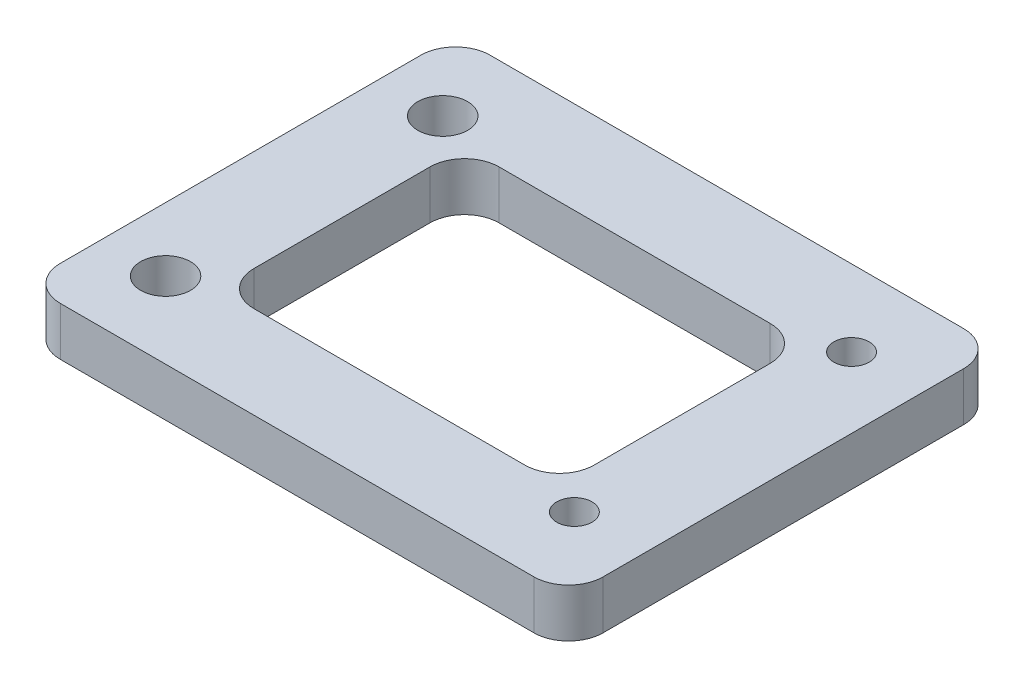
ISO-10303-21;
HEADER;
FILE_DESCRIPTION(('STEP AP214'),'2;1');
FILE_NAME('part.step','',(''),(''),'','','');
FILE_SCHEMA(('AUTOMOTIVE_DESIGN { 1 0 10303 214 1 1 1 1 }'));
ENDSEC;
DATA;
#1=APPLICATION_CONTEXT('core data for automotive mechanical design processes');
#2=APPLICATION_PROTOCOL_DEFINITION('international standard','automotive_design',2000,#1);
#3=PRODUCT_CONTEXT('',#1,'mechanical');
#4=PRODUCT('Part','Part','',(#3));
#5=PRODUCT_RELATED_PRODUCT_CATEGORY('part','',(#4));
#6=PRODUCT_DEFINITION_FORMATION('','',#4);
#7=PRODUCT_DEFINITION_CONTEXT('part definition',#1,'design');
#8=PRODUCT_DEFINITION('design','',#6,#7);
#9=PRODUCT_DEFINITION_SHAPE('','',#8);
#10=(LENGTH_UNIT() NAMED_UNIT(*) SI_UNIT(.MILLI.,.METRE.));
#11=(NAMED_UNIT(*) PLANE_ANGLE_UNIT() SI_UNIT($,.RADIAN.));
#12=(NAMED_UNIT(*) SI_UNIT($,.STERADIAN.) SOLID_ANGLE_UNIT());
#13=UNCERTAINTY_MEASURE_WITH_UNIT(LENGTH_MEASURE(1.E-05),#10,'distance_accuracy_value','');
#14=(GEOMETRIC_REPRESENTATION_CONTEXT(3) GLOBAL_UNCERTAINTY_ASSIGNED_CONTEXT((#13)) GLOBAL_UNIT_ASSIGNED_CONTEXT((#10,
#11,#12)) REPRESENTATION_CONTEXT('',''));
#15=CARTESIAN_POINT('',(0.,0.,0.));
#16=DIRECTION('',(0.,0.,1.));
#17=DIRECTION('',(1.,0.,0.));
#18=AXIS2_PLACEMENT_3D('',#15,#16,#17);
#19=CARTESIAN_POINT('',(0.,7.,0.));
#20=DIRECTION('',(0.,-1.,0.));
#21=DIRECTION('',(0.,0.,-1.));
#22=AXIS2_PLACEMENT_3D('',#19,#20,#21);
#23=PLANE('',#22);
#24=DIRECTION('',(0.,0.,1.));
#25=VECTOR('',#24,1.);
#26=CARTESIAN_POINT('',(-39.1771393497362,7.,31.0193391206574));
#27=LINE('',#26,#25);
#28=CARTESIAN_POINT('',(-39.1771393497362,7.,-26.0193391206574));
#29=VERTEX_POINT('',#28);
#30=CARTESIAN_POINT('',(-39.1771393497362,7.,26.0193391206574));
#31=VERTEX_POINT('',#30);
#32=EDGE_CURVE('E282',#29,#31,#27,.T.);
#33=ORIENTED_EDGE('',*,*,#32,.T.);
#34=CARTESIAN_POINT('',(-34.1771393497362,7.,26.0193391206574));
#35=DIRECTION('',(0.,-1.,0.));
#36=DIRECTION('',(0.,0.,-1.));
#37=AXIS2_PLACEMENT_3D('',#34,#35,#36);
#38=CIRCLE('',#37,5.);
#39=CARTESIAN_POINT('',(-34.1771393497362,7.,31.0193391206574));
#40=VERTEX_POINT('',#39);
#41=EDGE_CURVE('E201',#31,#40,#38,.F.);
#42=ORIENTED_EDGE('',*,*,#41,.T.);
#43=DIRECTION('',(1.,0.,0.));
#44=VECTOR('',#43,1.);
#45=CARTESIAN_POINT('',(-39.1771393497362,7.,31.0193391206574));
#46=LINE('',#45,#44);
#47=CARTESIAN_POINT('',(34.1771393497362,7.,31.0193391206574));
#48=VERTEX_POINT('',#47);
#49=EDGE_CURVE('E170',#40,#48,#46,.T.);
#50=ORIENTED_EDGE('',*,*,#49,.T.);
#51=CARTESIAN_POINT('',(34.1771393497362,7.,26.0193391206574));
#52=DIRECTION('',(0.,-1.,0.));
#53=DIRECTION('',(0.,0.,-1.));
#54=AXIS2_PLACEMENT_3D('',#51,#52,#53);
#55=CIRCLE('',#54,5.);
#56=CARTESIAN_POINT('',(39.1771393497362,7.,26.0193391206574));
#57=VERTEX_POINT('',#56);
#58=EDGE_CURVE('E199',#48,#57,#55,.F.);
#59=ORIENTED_EDGE('',*,*,#58,.T.);
#60=DIRECTION('',(0.,0.,-1.));
#61=VECTOR('',#60,1.);
#62=CARTESIAN_POINT('',(39.1771393497362,7.,31.0193391206574));
#63=LINE('',#62,#61);
#64=CARTESIAN_POINT('',(39.1771393497362,7.,-26.0193391206574));
#65=VERTEX_POINT('',#64);
#66=EDGE_CURVE('E177',#57,#65,#63,.T.);
#67=ORIENTED_EDGE('',*,*,#66,.T.);
#68=CARTESIAN_POINT('',(34.1771393497362,7.,-26.0193391206574));
#69=DIRECTION('',(0.,-1.,0.));
#70=DIRECTION('',(0.,0.,-1.));
#71=AXIS2_PLACEMENT_3D('',#68,#69,#70);
#72=CIRCLE('',#71,5.);
#73=CARTESIAN_POINT('',(34.1771393497362,7.,-31.0193391206574));
#74=VERTEX_POINT('',#73);
#75=EDGE_CURVE('E197',#65,#74,#72,.F.);
#76=ORIENTED_EDGE('',*,*,#75,.T.);
#77=DIRECTION('',(-1.,0.,0.));
#78=VECTOR('',#77,1.);
#79=CARTESIAN_POINT('',(-39.1771393497362,7.,-31.0193391206574));
#80=LINE('',#79,#78);
#81=CARTESIAN_POINT('',(-34.1771393497362,7.,-31.0193391206574));
#82=VERTEX_POINT('',#81);
#83=EDGE_CURVE('E181',#74,#82,#80,.T.);
#84=ORIENTED_EDGE('',*,*,#83,.T.);
#85=CARTESIAN_POINT('',(-34.1771393497362,7.,-26.0193391206574));
#86=DIRECTION('',(0.,-1.,0.));
#87=DIRECTION('',(0.,0.,-1.));
#88=AXIS2_PLACEMENT_3D('',#85,#86,#87);
#89=CIRCLE('',#88,5.);
#90=EDGE_CURVE('E195',#82,#29,#89,.F.);
#91=ORIENTED_EDGE('',*,*,#90,.T.);
#92=EDGE_LOOP('',(#33,#42,#50,#59,#67,#76,#84,#91));
#93=FACE_BOUND('',#92,.T.);
#94=DIRECTION('',(0.,0.,-1.));
#95=VECTOR('',#94,1.);
#96=CARTESIAN_POINT('',(24.5578802097972,7.,17.7048808811984));
#97=LINE('',#96,#95);
#98=CARTESIAN_POINT('',(24.5578802097972,7.,12.7048808811984));
#99=VERTEX_POINT('',#98);
#100=CARTESIAN_POINT('',(24.5578802097972,7.,-12.7048808811984));
#101=VERTEX_POINT('',#100);
#102=EDGE_CURVE('E262',#99,#101,#97,.T.);
#103=ORIENTED_EDGE('',*,*,#102,.F.);
#104=CARTESIAN_POINT('',(19.5578802097972,7.,12.7048808811984));
#105=DIRECTION('',(0.,-1.,0.));
#106=DIRECTION('',(0.,0.,-1.));
#107=AXIS2_PLACEMENT_3D('',#104,#105,#106);
#108=CIRCLE('',#107,5.);
#109=CARTESIAN_POINT('',(19.5578802097972,7.,17.7048808811984));
#110=VERTEX_POINT('',#109);
#111=EDGE_CURVE('E238',#99,#110,#108,.T.);
#112=ORIENTED_EDGE('',*,*,#111,.T.);
#113=DIRECTION('',(1.,0.,0.));
#114=VECTOR('',#113,1.);
#115=CARTESIAN_POINT('',(-24.5578802097972,7.,17.7048808811984));
#116=LINE('',#115,#114);
#117=CARTESIAN_POINT('',(-19.5578802097972,7.,17.7048808811984));
#118=VERTEX_POINT('',#117);
#119=EDGE_CURVE('E264',#118,#110,#116,.T.);
#120=ORIENTED_EDGE('',*,*,#119,.F.);
#121=CARTESIAN_POINT('',(-19.5578802097972,7.,12.7048808811984));
#122=DIRECTION('',(0.,-1.,0.));
#123=DIRECTION('',(0.,0.,-1.));
#124=AXIS2_PLACEMENT_3D('',#121,#122,#123);
#125=CIRCLE('',#124,5.);
#126=CARTESIAN_POINT('',(-24.5578802097972,7.,12.7048808811984));
#127=VERTEX_POINT('',#126);
#128=EDGE_CURVE('E234',#118,#127,#125,.T.);
#129=ORIENTED_EDGE('',*,*,#128,.T.);
#130=DIRECTION('',(0.,0.,1.));
#131=VECTOR('',#130,1.);
#132=CARTESIAN_POINT('',(-24.5578802097972,7.,17.7048808811984));
#133=LINE('',#132,#131);
#134=CARTESIAN_POINT('',(-24.5578802097972,7.,-12.7048808811984));
#135=VERTEX_POINT('',#134);
#136=EDGE_CURVE('E261',#135,#127,#133,.T.);
#137=ORIENTED_EDGE('',*,*,#136,.F.);
#138=CARTESIAN_POINT('',(-19.5578802097972,7.,-12.7048808811984));
#139=DIRECTION('',(0.,-1.,0.));
#140=DIRECTION('',(0.,0.,-1.));
#141=AXIS2_PLACEMENT_3D('',#138,#139,#140);
#142=CIRCLE('',#141,5.);
#143=CARTESIAN_POINT('',(-19.5578802097972,7.,-17.7048808811984));
#144=VERTEX_POINT('',#143);
#145=EDGE_CURVE('E11',#135,#144,#142,.T.);
#146=ORIENTED_EDGE('',*,*,#145,.T.);
#147=DIRECTION('',(-1.,0.,0.));
#148=VECTOR('',#147,1.);
#149=CARTESIAN_POINT('',(-24.5578802097972,7.,-17.7048808811984));
#150=LINE('',#149,#148);
#151=CARTESIAN_POINT('',(19.5578802097972,7.,-17.7048808811984));
#152=VERTEX_POINT('',#151);
#153=EDGE_CURVE('E259',#152,#144,#150,.T.);
#154=ORIENTED_EDGE('',*,*,#153,.F.);
#155=CARTESIAN_POINT('',(19.5578802097972,7.,-12.7048808811984));
#156=DIRECTION('',(0.,-1.,0.));
#157=DIRECTION('',(0.,0.,-1.));
#158=AXIS2_PLACEMENT_3D('',#155,#156,#157);
#159=CIRCLE('',#158,5.);
#160=EDGE_CURVE('E242',#152,#101,#159,.T.);
#161=ORIENTED_EDGE('',*,*,#160,.T.);
#162=EDGE_LOOP('',(#103,#112,#120,#129,#137,#146,#154,#161));
#163=FACE_BOUND('',#162,.T.);
#164=CARTESIAN_POINT('',(29.,7.,-20.));
#165=DIRECTION('',(0.,1.,0.));
#166=DIRECTION('',(0.,0.,1.));
#167=AXIS2_PLACEMENT_3D('',#164,#165,#166);
#168=CIRCLE('',#167,2.55);
#169=CARTESIAN_POINT('',(29.,7.,-17.45));
#170=VERTEX_POINT('',#169);
#171=EDGE_CURVE('E276',#170,#170,#168,.T.);
#172=ORIENTED_EDGE('',*,*,#171,.F.);
#173=EDGE_LOOP('',(#172));
#174=FACE_BOUND('',#173,.T.);
#175=CARTESIAN_POINT('',(29.,7.,20.));
#176=DIRECTION('',(0.,1.,0.));
#177=DIRECTION('',(0.,0.,1.));
#178=AXIS2_PLACEMENT_3D('',#175,#176,#177);
#179=CIRCLE('',#178,2.55);
#180=CARTESIAN_POINT('',(29.,7.,22.55));
#181=VERTEX_POINT('',#180);
#182=EDGE_CURVE('E369',#181,#181,#179,.T.);
#183=ORIENTED_EDGE('',*,*,#182,.F.);
#184=EDGE_LOOP('',(#183));
#185=FACE_BOUND('',#184,.T.);
#186=CARTESIAN_POINT('',(-30.,7.,20.));
#187=DIRECTION('',(0.,1.,0.));
#188=DIRECTION('',(0.,0.,1.));
#189=AXIS2_PLACEMENT_3D('',#186,#187,#188);
#190=CIRCLE('',#189,3.6);
#191=CARTESIAN_POINT('',(-30.,7.,23.6));
#192=VERTEX_POINT('',#191);
#193=EDGE_CURVE('E363',#192,#192,#190,.T.);
#194=ORIENTED_EDGE('',*,*,#193,.F.);
#195=EDGE_LOOP('',(#194));
#196=FACE_BOUND('',#195,.T.);
#197=CARTESIAN_POINT('',(-30.,7.,-20.));
#198=DIRECTION('',(0.,1.,0.));
#199=DIRECTION('',(0.,0.,1.));
#200=AXIS2_PLACEMENT_3D('',#197,#198,#199);
#201=CIRCLE('',#200,3.6);
#202=CARTESIAN_POINT('',(-30.,7.,-16.4));
#203=VERTEX_POINT('',#202);
#204=EDGE_CURVE('E354',#203,#203,#201,.T.);
#205=ORIENTED_EDGE('',*,*,#204,.F.);
#206=EDGE_LOOP('',(#205));
#207=FACE_BOUND('',#206,.T.);
#208=ADVANCED_FACE('F37',(#93,#163,#174,#185,#196,#207),#23,.F.);
#209=CARTESIAN_POINT('',(0.,0.,0.));
#210=DIRECTION('',(0.,-1.,0.));
#211=DIRECTION('',(0.,0.,-1.));
#212=AXIS2_PLACEMENT_3D('',#209,#210,#211);
#213=PLANE('',#212);
#214=CARTESIAN_POINT('',(-30.,0.,20.));
#215=DIRECTION('',(0.,1.,0.));
#216=DIRECTION('',(0.,0.,1.));
#217=AXIS2_PLACEMENT_3D('',#214,#215,#216);
#218=CIRCLE('',#217,3.6);
#219=CARTESIAN_POINT('',(-30.,0.,23.6));
#220=VERTEX_POINT('',#219);
#221=EDGE_CURVE('E360',#220,#220,#218,.T.);
#222=ORIENTED_EDGE('',*,*,#221,.T.);
#223=EDGE_LOOP('',(#222));
#224=FACE_BOUND('',#223,.T.);
#225=CARTESIAN_POINT('',(29.,0.,-20.));
#226=DIRECTION('',(0.,1.,0.));
#227=DIRECTION('',(0.,0.,1.));
#228=AXIS2_PLACEMENT_3D('',#225,#226,#227);
#229=CIRCLE('',#228,2.55);
#230=CARTESIAN_POINT('',(29.,0.,-17.45));
#231=VERTEX_POINT('',#230);
#232=EDGE_CURVE('E372',#231,#231,#229,.T.);
#233=ORIENTED_EDGE('',*,*,#232,.T.);
#234=EDGE_LOOP('',(#233));
#235=FACE_BOUND('',#234,.T.);
#236=DIRECTION('',(1.,0.,0.));
#237=VECTOR('',#236,1.);
#238=CARTESIAN_POINT('',(-39.1771393497362,0.,31.0193391206574));
#239=LINE('',#238,#237);
#240=CARTESIAN_POINT('',(-34.1771393497362,0.,31.0193391206574));
#241=VERTEX_POINT('',#240);
#242=CARTESIAN_POINT('',(34.1771393497362,0.,31.0193391206574));
#243=VERTEX_POINT('',#242);
#244=EDGE_CURVE('E167',#241,#243,#239,.T.);
#245=ORIENTED_EDGE('',*,*,#244,.F.);
#246=CARTESIAN_POINT('',(-34.1771393497362,0.,26.0193391206574));
#247=DIRECTION('',(0.,-1.,0.));
#248=DIRECTION('',(0.,0.,-1.));
#249=AXIS2_PLACEMENT_3D('',#246,#247,#248);
#250=CIRCLE('',#249,5.);
#251=CARTESIAN_POINT('',(-39.1771393497362,0.,26.0193391206574));
#252=VERTEX_POINT('',#251);
#253=EDGE_CURVE('E150',#241,#252,#250,.T.);
#254=ORIENTED_EDGE('',*,*,#253,.T.);
#255=DIRECTION('',(0.,0.,1.));
#256=VECTOR('',#255,1.);
#257=CARTESIAN_POINT('',(-39.1771393497362,0.,31.0193391206574));
#258=LINE('',#257,#256);
#259=CARTESIAN_POINT('',(-39.1771393497362,0.,-26.0193391206574));
#260=VERTEX_POINT('',#259);
#261=EDGE_CURVE('E178',#260,#252,#258,.T.);
#262=ORIENTED_EDGE('',*,*,#261,.F.);
#263=CARTESIAN_POINT('',(-34.1771393497362,0.,-26.0193391206574));
#264=DIRECTION('',(0.,-1.,0.));
#265=DIRECTION('',(0.,0.,-1.));
#266=AXIS2_PLACEMENT_3D('',#263,#264,#265);
#267=CIRCLE('',#266,5.);
#268=CARTESIAN_POINT('',(-34.1771393497362,0.,-31.0193391206574));
#269=VERTEX_POINT('',#268);
#270=EDGE_CURVE('E171',#260,#269,#267,.T.);
#271=ORIENTED_EDGE('',*,*,#270,.T.);
#272=DIRECTION('',(-1.,0.,0.));
#273=VECTOR('',#272,1.);
#274=CARTESIAN_POINT('',(-39.1771393497362,0.,-31.0193391206574));
#275=LINE('',#274,#273);
#276=CARTESIAN_POINT('',(34.1771393497362,0.,-31.0193391206574));
#277=VERTEX_POINT('',#276);
#278=EDGE_CURVE('E183',#277,#269,#275,.T.);
#279=ORIENTED_EDGE('',*,*,#278,.F.);
#280=CARTESIAN_POINT('',(34.1771393497362,0.,-26.0193391206574));
#281=DIRECTION('',(0.,-1.,0.));
#282=DIRECTION('',(0.,0.,-1.));
#283=AXIS2_PLACEMENT_3D('',#280,#281,#282);
#284=CIRCLE('',#283,5.);
#285=CARTESIAN_POINT('',(39.1771393497362,0.,-26.0193391206574));
#286=VERTEX_POINT('',#285);
#287=EDGE_CURVE('E189',#277,#286,#284,.T.);
#288=ORIENTED_EDGE('',*,*,#287,.T.);
#289=DIRECTION('',(0.,0.,-1.));
#290=VECTOR('',#289,1.);
#291=CARTESIAN_POINT('',(39.1771393497362,0.,31.0193391206574));
#292=LINE('',#291,#290);
#293=CARTESIAN_POINT('',(39.1771393497362,0.,26.0193391206574));
#294=VERTEX_POINT('',#293);
#295=EDGE_CURVE('E272',#294,#286,#292,.T.);
#296=ORIENTED_EDGE('',*,*,#295,.F.);
#297=CARTESIAN_POINT('',(34.1771393497362,0.,26.0193391206574));
#298=DIRECTION('',(0.,-1.,0.));
#299=DIRECTION('',(0.,0.,-1.));
#300=AXIS2_PLACEMENT_3D('',#297,#298,#299);
#301=CIRCLE('',#300,5.);
#302=EDGE_CURVE('E161',#294,#243,#301,.T.);
#303=ORIENTED_EDGE('',*,*,#302,.T.);
#304=EDGE_LOOP('',(#245,#254,#262,#271,#279,#288,#296,#303));
#305=FACE_BOUND('',#304,.T.);
#306=DIRECTION('',(0.,0.,1.));
#307=VECTOR('',#306,1.);
#308=CARTESIAN_POINT('',(-24.5578802097972,0.,17.7048808811984));
#309=LINE('',#308,#307);
#310=CARTESIAN_POINT('',(-24.5578802097972,0.,-12.7048808811984));
#311=VERTEX_POINT('',#310);
#312=CARTESIAN_POINT('',(-24.5578802097972,0.,12.7048808811984));
#313=VERTEX_POINT('',#312);
#314=EDGE_CURVE('E247',#311,#313,#309,.T.);
#315=ORIENTED_EDGE('',*,*,#314,.T.);
#316=CARTESIAN_POINT('',(-19.5578802097972,0.,12.7048808811984));
#317=DIRECTION('',(0.,-1.,0.));
#318=DIRECTION('',(0.,0.,-1.));
#319=AXIS2_PLACEMENT_3D('',#316,#317,#318);
#320=CIRCLE('',#319,5.);
#321=CARTESIAN_POINT('',(-19.5578802097972,0.,17.7048808811984));
#322=VERTEX_POINT('',#321);
#323=EDGE_CURVE('E232',#313,#322,#320,.F.);
#324=ORIENTED_EDGE('',*,*,#323,.T.);
#325=DIRECTION('',(1.,0.,0.));
#326=VECTOR('',#325,1.);
#327=CARTESIAN_POINT('',(-24.5578802097972,0.,17.7048808811984));
#328=LINE('',#327,#326);
#329=CARTESIAN_POINT('',(19.5578802097972,0.,17.7048808811984));
#330=VERTEX_POINT('',#329);
#331=EDGE_CURVE('E256',#322,#330,#328,.T.);
#332=ORIENTED_EDGE('',*,*,#331,.T.);
#333=CARTESIAN_POINT('',(19.5578802097972,0.,12.7048808811984));
#334=DIRECTION('',(0.,-1.,0.));
#335=DIRECTION('',(0.,0.,-1.));
#336=AXIS2_PLACEMENT_3D('',#333,#334,#335);
#337=CIRCLE('',#336,5.);
#338=CARTESIAN_POINT('',(24.5578802097972,0.,12.7048808811984));
#339=VERTEX_POINT('',#338);
#340=EDGE_CURVE('E236',#330,#339,#337,.F.);
#341=ORIENTED_EDGE('',*,*,#340,.T.);
#342=DIRECTION('',(0.,0.,-1.));
#343=VECTOR('',#342,1.);
#344=CARTESIAN_POINT('',(24.5578802097972,0.,17.7048808811984));
#345=LINE('',#344,#343);
#346=CARTESIAN_POINT('',(24.5578802097972,0.,-12.7048808811984));
#347=VERTEX_POINT('',#346);
#348=EDGE_CURVE('E273',#339,#347,#345,.T.);
#349=ORIENTED_EDGE('',*,*,#348,.T.);
#350=CARTESIAN_POINT('',(19.5578802097972,0.,-12.7048808811984));
#351=DIRECTION('',(0.,-1.,0.));
#352=DIRECTION('',(0.,0.,-1.));
#353=AXIS2_PLACEMENT_3D('',#350,#351,#352);
#354=CIRCLE('',#353,5.);
#355=CARTESIAN_POINT('',(19.5578802097972,0.,-17.7048808811984));
#356=VERTEX_POINT('',#355);
#357=EDGE_CURVE('E240',#347,#356,#354,.F.);
#358=ORIENTED_EDGE('',*,*,#357,.T.);
#359=DIRECTION('',(-1.,0.,0.));
#360=VECTOR('',#359,1.);
#361=CARTESIAN_POINT('',(-24.5578802097972,0.,-17.7048808811984));
#362=LINE('',#361,#360);
#363=CARTESIAN_POINT('',(-19.5578802097972,0.,-17.7048808811984));
#364=VERTEX_POINT('',#363);
#365=EDGE_CURVE('E248',#356,#364,#362,.T.);
#366=ORIENTED_EDGE('',*,*,#365,.T.);
#367=CARTESIAN_POINT('',(-19.5578802097972,0.,-12.7048808811984));
#368=DIRECTION('',(0.,-1.,0.));
#369=DIRECTION('',(0.,0.,-1.));
#370=AXIS2_PLACEMENT_3D('',#367,#368,#369);
#371=CIRCLE('',#370,5.);
#372=EDGE_CURVE('E45',#364,#311,#371,.F.);
#373=ORIENTED_EDGE('',*,*,#372,.T.);
#374=EDGE_LOOP('',(#315,#324,#332,#341,#349,#358,#366,#373));
#375=FACE_BOUND('',#374,.T.);
#376=CARTESIAN_POINT('',(29.,0.,20.));
#377=DIRECTION('',(0.,1.,0.));
#378=DIRECTION('',(0.,0.,1.));
#379=AXIS2_PLACEMENT_3D('',#376,#377,#378);
#380=CIRCLE('',#379,2.55);
#381=CARTESIAN_POINT('',(29.,0.,22.55));
#382=VERTEX_POINT('',#381);
#383=EDGE_CURVE('E366',#382,#382,#380,.T.);
#384=ORIENTED_EDGE('',*,*,#383,.T.);
#385=EDGE_LOOP('',(#384));
#386=FACE_BOUND('',#385,.T.);
#387=CARTESIAN_POINT('',(-30.,0.,-20.));
#388=DIRECTION('',(0.,1.,0.));
#389=DIRECTION('',(0.,0.,1.));
#390=AXIS2_PLACEMENT_3D('',#387,#388,#389);
#391=CIRCLE('',#390,3.6);
#392=CARTESIAN_POINT('',(-30.,0.,-16.4));
#393=VERTEX_POINT('',#392);
#394=EDGE_CURVE('E357',#393,#393,#391,.T.);
#395=ORIENTED_EDGE('',*,*,#394,.T.);
#396=EDGE_LOOP('',(#395));
#397=FACE_BOUND('',#396,.T.);
#398=ADVANCED_FACE('F174',(#224,#235,#305,#375,#386,#397),#213,.T.);
#399=CARTESIAN_POINT('',(39.1771393497362,7.,31.0193391206574));
#400=DIRECTION('',(-1.,0.,0.));
#401=DIRECTION('',(0.,0.,1.));
#402=AXIS2_PLACEMENT_3D('',#399,#400,#401);
#403=PLANE('',#402);
#404=ORIENTED_EDGE('',*,*,#66,.F.);
#405=DIRECTION('',(0.,-1.,0.));
#406=VECTOR('',#405,1.);
#407=CARTESIAN_POINT('',(39.1771393497362,7.,26.0193391206574));
#408=LINE('',#407,#406);
#409=EDGE_CURVE('E215',#57,#294,#408,.T.);
#410=ORIENTED_EDGE('',*,*,#409,.T.);
#411=ORIENTED_EDGE('',*,*,#295,.T.);
#412=DIRECTION('',(0.,-1.,0.));
#413=VECTOR('',#412,1.);
#414=CARTESIAN_POINT('',(39.1771393497362,7.,-26.0193391206574));
#415=LINE('',#414,#413);
#416=EDGE_CURVE('E213',#286,#65,#415,.F.);
#417=ORIENTED_EDGE('',*,*,#416,.T.);
#418=EDGE_LOOP('',(#404,#410,#411,#417));
#419=FACE_BOUND('',#418,.T.);
#420=ADVANCED_FACE('F310',(#419),#403,.F.);
#421=CARTESIAN_POINT('',(-39.1771393497362,7.,-31.0193391206574));
#422=DIRECTION('',(0.,0.,1.));
#423=DIRECTION('',(1.,0.,0.));
#424=AXIS2_PLACEMENT_3D('',#421,#422,#423);
#425=PLANE('',#424);
#426=ORIENTED_EDGE('',*,*,#83,.F.);
#427=DIRECTION('',(0.,-1.,0.));
#428=VECTOR('',#427,1.);
#429=CARTESIAN_POINT('',(34.1771393497362,7.,-31.0193391206574));
#430=LINE('',#429,#428);
#431=EDGE_CURVE('E229',#74,#277,#430,.T.);
#432=ORIENTED_EDGE('',*,*,#431,.T.);
#433=ORIENTED_EDGE('',*,*,#278,.T.);
#434=DIRECTION('',(0.,-1.,0.));
#435=VECTOR('',#434,1.);
#436=CARTESIAN_POINT('',(-34.1771393497362,7.,-31.0193391206574));
#437=LINE('',#436,#435);
#438=EDGE_CURVE('E227',#269,#82,#437,.F.);
#439=ORIENTED_EDGE('',*,*,#438,.T.);
#440=EDGE_LOOP('',(#426,#432,#433,#439));
#441=FACE_BOUND('',#440,.T.);
#442=ADVANCED_FACE('F292',(#441),#425,.F.);
#443=CARTESIAN_POINT('',(-39.1771393497362,7.,31.0193391206574));
#444=DIRECTION('',(1.,0.,0.));
#445=DIRECTION('',(0.,0.,-1.));
#446=AXIS2_PLACEMENT_3D('',#443,#444,#445);
#447=PLANE('',#446);
#448=ORIENTED_EDGE('',*,*,#261,.T.);
#449=DIRECTION('',(0.,-1.,0.));
#450=VECTOR('',#449,1.);
#451=CARTESIAN_POINT('',(-39.1771393497362,7.,26.0193391206574));
#452=LINE('',#451,#450);
#453=EDGE_CURVE('E155',#252,#31,#452,.F.);
#454=ORIENTED_EDGE('',*,*,#453,.T.);
#455=ORIENTED_EDGE('',*,*,#32,.F.);
#456=DIRECTION('',(0.,-1.,0.));
#457=VECTOR('',#456,1.);
#458=CARTESIAN_POINT('',(-39.1771393497362,7.,-26.0193391206574));
#459=LINE('',#458,#457);
#460=EDGE_CURVE('E160',#29,#260,#459,.T.);
#461=ORIENTED_EDGE('',*,*,#460,.T.);
#462=EDGE_LOOP('',(#448,#454,#455,#461));
#463=FACE_BOUND('',#462,.T.);
#464=ADVANCED_FACE('F301',(#463),#447,.F.);
#465=CARTESIAN_POINT('',(-39.1771393497362,7.,31.0193391206574));
#466=DIRECTION('',(0.,0.,-1.));
#467=DIRECTION('',(-1.,0.,0.));
#468=AXIS2_PLACEMENT_3D('',#465,#466,#467);
#469=PLANE('',#468);
#470=ORIENTED_EDGE('',*,*,#49,.F.);
#471=DIRECTION('',(0.,-1.,0.));
#472=VECTOR('',#471,1.);
#473=CARTESIAN_POINT('',(-34.1771393497362,7.,31.0193391206574));
#474=LINE('',#473,#472);
#475=EDGE_CURVE('E154',#40,#241,#474,.T.);
#476=ORIENTED_EDGE('',*,*,#475,.T.);
#477=ORIENTED_EDGE('',*,*,#244,.T.);
#478=DIRECTION('',(0.,-1.,0.));
#479=VECTOR('',#478,1.);
#480=CARTESIAN_POINT('',(34.1771393497362,7.,31.0193391206574));
#481=LINE('',#480,#479);
#482=EDGE_CURVE('E172',#243,#48,#481,.F.);
#483=ORIENTED_EDGE('',*,*,#482,.T.);
#484=EDGE_LOOP('',(#470,#476,#477,#483));
#485=FACE_BOUND('',#484,.T.);
#486=ADVANCED_FACE('F166',(#485),#469,.F.);
#487=CARTESIAN_POINT('',(24.5578802097972,7.,17.7048808811984));
#488=DIRECTION('',(-1.,0.,0.));
#489=DIRECTION('',(0.,0.,1.));
#490=AXIS2_PLACEMENT_3D('',#487,#488,#489);
#491=PLANE('',#490);
#492=ORIENTED_EDGE('',*,*,#348,.F.);
#493=DIRECTION('',(0.,-1.,0.));
#494=VECTOR('',#493,1.);
#495=CARTESIAN_POINT('',(24.5578802097972,7.,12.7048808811984));
#496=LINE('',#495,#494);
#497=EDGE_CURVE('E221',#339,#99,#496,.F.);
#498=ORIENTED_EDGE('',*,*,#497,.T.);
#499=ORIENTED_EDGE('',*,*,#102,.T.);
#500=DIRECTION('',(0.,-1.,0.));
#501=VECTOR('',#500,1.);
#502=CARTESIAN_POINT('',(24.5578802097972,0.,-12.7048808811984));
#503=LINE('',#502,#501);
#504=EDGE_CURVE('E218',#101,#347,#503,.T.);
#505=ORIENTED_EDGE('',*,*,#504,.T.);
#506=EDGE_LOOP('',(#492,#498,#499,#505));
#507=FACE_BOUND('',#506,.T.);
#508=ADVANCED_FACE('F308',(#507),#491,.T.);
#509=CARTESIAN_POINT('',(-24.5578802097972,7.,-17.7048808811984));
#510=DIRECTION('',(0.,0.,1.));
#511=DIRECTION('',(1.,0.,0.));
#512=AXIS2_PLACEMENT_3D('',#509,#510,#511);
#513=PLANE('',#512);
#514=ORIENTED_EDGE('',*,*,#365,.F.);
#515=DIRECTION('',(0.,-1.,0.));
#516=VECTOR('',#515,1.);
#517=CARTESIAN_POINT('',(19.5578802097972,7.,-17.7048808811984));
#518=LINE('',#517,#516);
#519=EDGE_CURVE('E57',#356,#152,#518,.F.);
#520=ORIENTED_EDGE('',*,*,#519,.T.);
#521=ORIENTED_EDGE('',*,*,#153,.T.);
#522=DIRECTION('',(0.,-1.,0.));
#523=VECTOR('',#522,1.);
#524=CARTESIAN_POINT('',(-19.5578802097972,0.,-17.7048808811984));
#525=LINE('',#524,#523);
#526=EDGE_CURVE('E223',#144,#364,#525,.T.);
#527=ORIENTED_EDGE('',*,*,#526,.T.);
#528=EDGE_LOOP('',(#514,#520,#521,#527));
#529=FACE_BOUND('',#528,.T.);
#530=ADVANCED_FACE('F258',(#529),#513,.T.);
#531=CARTESIAN_POINT('',(-24.5578802097972,7.,17.7048808811984));
#532=DIRECTION('',(1.,0.,0.));
#533=DIRECTION('',(0.,0.,-1.));
#534=AXIS2_PLACEMENT_3D('',#531,#532,#533);
#535=PLANE('',#534);
#536=ORIENTED_EDGE('',*,*,#136,.T.);
#537=DIRECTION('',(0.,-1.,0.));
#538=VECTOR('',#537,1.);
#539=CARTESIAN_POINT('',(-24.5578802097972,0.,12.7048808811984));
#540=LINE('',#539,#538);
#541=EDGE_CURVE('E205',#127,#313,#540,.T.);
#542=ORIENTED_EDGE('',*,*,#541,.T.);
#543=ORIENTED_EDGE('',*,*,#314,.F.);
#544=DIRECTION('',(0.,-1.,0.));
#545=VECTOR('',#544,1.);
#546=CARTESIAN_POINT('',(-24.5578802097972,7.,-12.7048808811984));
#547=LINE('',#546,#545);
#548=EDGE_CURVE('E203',#311,#135,#547,.F.);
#549=ORIENTED_EDGE('',*,*,#548,.T.);
#550=EDGE_LOOP('',(#536,#542,#543,#549));
#551=FACE_BOUND('',#550,.T.);
#552=ADVANCED_FACE('F254',(#551),#535,.T.);
#553=CARTESIAN_POINT('',(-24.5578802097972,7.,17.7048808811984));
#554=DIRECTION('',(0.,0.,-1.));
#555=DIRECTION('',(-1.,0.,0.));
#556=AXIS2_PLACEMENT_3D('',#553,#554,#555);
#557=PLANE('',#556);
#558=ORIENTED_EDGE('',*,*,#331,.F.);
#559=DIRECTION('',(0.,-1.,0.));
#560=VECTOR('',#559,1.);
#561=CARTESIAN_POINT('',(-19.5578802097972,7.,17.7048808811984));
#562=LINE('',#561,#560);
#563=EDGE_CURVE('E211',#322,#118,#562,.F.);
#564=ORIENTED_EDGE('',*,*,#563,.T.);
#565=ORIENTED_EDGE('',*,*,#119,.T.);
#566=DIRECTION('',(0.,-1.,0.));
#567=VECTOR('',#566,1.);
#568=CARTESIAN_POINT('',(19.5578802097972,0.,17.7048808811984));
#569=LINE('',#568,#567);
#570=EDGE_CURVE('E208',#110,#330,#569,.T.);
#571=ORIENTED_EDGE('',*,*,#570,.T.);
#572=EDGE_LOOP('',(#558,#564,#565,#571));
#573=FACE_BOUND('',#572,.T.);
#574=ADVANCED_FACE('F327',(#573),#557,.T.);
#575=CARTESIAN_POINT('',(29.,7.,-20.));
#576=DIRECTION('',(0.,-1.,0.));
#577=DIRECTION('',(0.,0.,-1.));
#578=AXIS2_PLACEMENT_3D('',#575,#576,#577);
#579=CYLINDRICAL_SURFACE('',#578,2.55);
#580=ORIENTED_EDGE('',*,*,#171,.T.);
#581=EDGE_LOOP('',(#580));
#582=FACE_BOUND('',#581,.T.);
#583=ORIENTED_EDGE('',*,*,#232,.F.);
#584=EDGE_LOOP('',(#583));
#585=FACE_BOUND('',#584,.T.);
#586=ADVANCED_FACE('F330',(#582,#585),#579,.F.);
#587=CARTESIAN_POINT('',(29.,7.,20.));
#588=DIRECTION('',(0.,-1.,0.));
#589=DIRECTION('',(0.,0.,-1.));
#590=AXIS2_PLACEMENT_3D('',#587,#588,#589);
#591=CYLINDRICAL_SURFACE('',#590,2.55);
#592=ORIENTED_EDGE('',*,*,#182,.T.);
#593=EDGE_LOOP('',(#592));
#594=FACE_BOUND('',#593,.T.);
#595=ORIENTED_EDGE('',*,*,#383,.F.);
#596=EDGE_LOOP('',(#595));
#597=FACE_BOUND('',#596,.T.);
#598=ADVANCED_FACE('F334',(#594,#597),#591,.F.);
#599=CARTESIAN_POINT('',(-30.,7.,20.));
#600=DIRECTION('',(0.,-1.,0.));
#601=DIRECTION('',(0.,0.,-1.));
#602=AXIS2_PLACEMENT_3D('',#599,#600,#601);
#603=CYLINDRICAL_SURFACE('',#602,3.6);
#604=ORIENTED_EDGE('',*,*,#193,.T.);
#605=EDGE_LOOP('',(#604));
#606=FACE_BOUND('',#605,.T.);
#607=ORIENTED_EDGE('',*,*,#221,.F.);
#608=EDGE_LOOP('',(#607));
#609=FACE_BOUND('',#608,.T.);
#610=ADVANCED_FACE('F338',(#606,#609),#603,.F.);
#611=CARTESIAN_POINT('',(-30.,7.,-20.));
#612=DIRECTION('',(0.,-1.,0.));
#613=DIRECTION('',(0.,0.,-1.));
#614=AXIS2_PLACEMENT_3D('',#611,#612,#613);
#615=CYLINDRICAL_SURFACE('',#614,3.6);
#616=ORIENTED_EDGE('',*,*,#204,.T.);
#617=EDGE_LOOP('',(#616));
#618=FACE_BOUND('',#617,.T.);
#619=ORIENTED_EDGE('',*,*,#394,.F.);
#620=EDGE_LOOP('',(#619));
#621=FACE_BOUND('',#620,.T.);
#622=ADVANCED_FACE('F342',(#618,#621),#615,.F.);
#623=CARTESIAN_POINT('',(-34.1771393497362,7.,26.0193391206574));
#624=DIRECTION('',(0.,-1.,0.));
#625=DIRECTION('',(0.,0.,-1.));
#626=AXIS2_PLACEMENT_3D('',#623,#624,#625);
#627=CYLINDRICAL_SURFACE('',#626,5.);
#628=ORIENTED_EDGE('',*,*,#41,.F.);
#629=ORIENTED_EDGE('',*,*,#453,.F.);
#630=ORIENTED_EDGE('',*,*,#253,.F.);
#631=ORIENTED_EDGE('',*,*,#475,.F.);
#632=EDGE_LOOP('',(#628,#629,#630,#631));
#633=FACE_BOUND('',#632,.T.);
#634=ADVANCED_FACE('F153',(#633),#627,.T.);
#635=CARTESIAN_POINT('',(-19.5578802097972,7.,12.7048808811984));
#636=DIRECTION('',(0.,1.,0.));
#637=DIRECTION('',(0.,0.,1.));
#638=AXIS2_PLACEMENT_3D('',#635,#636,#637);
#639=CYLINDRICAL_SURFACE('',#638,5.);
#640=ORIENTED_EDGE('',*,*,#128,.F.);
#641=ORIENTED_EDGE('',*,*,#563,.F.);
#642=ORIENTED_EDGE('',*,*,#323,.F.);
#643=ORIENTED_EDGE('',*,*,#541,.F.);
#644=EDGE_LOOP('',(#640,#641,#642,#643));
#645=FACE_BOUND('',#644,.T.);
#646=ADVANCED_FACE('F349',(#645),#639,.F.);
#647=CARTESIAN_POINT('',(34.1771393497362,7.,26.0193391206574));
#648=DIRECTION('',(0.,-1.,0.));
#649=DIRECTION('',(0.,0.,-1.));
#650=AXIS2_PLACEMENT_3D('',#647,#648,#649);
#651=CYLINDRICAL_SURFACE('',#650,5.);
#652=ORIENTED_EDGE('',*,*,#58,.F.);
#653=ORIENTED_EDGE('',*,*,#482,.F.);
#654=ORIENTED_EDGE('',*,*,#302,.F.);
#655=ORIENTED_EDGE('',*,*,#409,.F.);
#656=EDGE_LOOP('',(#652,#653,#654,#655));
#657=FACE_BOUND('',#656,.T.);
#658=ADVANCED_FACE('F394',(#657),#651,.T.);
#659=CARTESIAN_POINT('',(19.5578802097972,7.,12.7048808811984));
#660=DIRECTION('',(0.,1.,0.));
#661=DIRECTION('',(0.,0.,1.));
#662=AXIS2_PLACEMENT_3D('',#659,#660,#661);
#663=CYLINDRICAL_SURFACE('',#662,5.);
#664=ORIENTED_EDGE('',*,*,#111,.F.);
#665=ORIENTED_EDGE('',*,*,#497,.F.);
#666=ORIENTED_EDGE('',*,*,#340,.F.);
#667=ORIENTED_EDGE('',*,*,#570,.F.);
#668=EDGE_LOOP('',(#664,#665,#666,#667));
#669=FACE_BOUND('',#668,.T.);
#670=ADVANCED_FACE('F401',(#669),#663,.F.);
#671=CARTESIAN_POINT('',(19.5578802097972,7.,-12.7048808811984));
#672=DIRECTION('',(0.,1.,0.));
#673=DIRECTION('',(0.,0.,1.));
#674=AXIS2_PLACEMENT_3D('',#671,#672,#673);
#675=CYLINDRICAL_SURFACE('',#674,5.);
#676=ORIENTED_EDGE('',*,*,#160,.F.);
#677=ORIENTED_EDGE('',*,*,#519,.F.);
#678=ORIENTED_EDGE('',*,*,#357,.F.);
#679=ORIENTED_EDGE('',*,*,#504,.F.);
#680=EDGE_LOOP('',(#676,#677,#678,#679));
#681=FACE_BOUND('',#680,.T.);
#682=ADVANCED_FACE('F405',(#681),#675,.F.);
#683=CARTESIAN_POINT('',(34.1771393497362,7.,-26.0193391206574));
#684=DIRECTION('',(0.,-1.,0.));
#685=DIRECTION('',(0.,0.,-1.));
#686=AXIS2_PLACEMENT_3D('',#683,#684,#685);
#687=CYLINDRICAL_SURFACE('',#686,5.);
#688=ORIENTED_EDGE('',*,*,#75,.F.);
#689=ORIENTED_EDGE('',*,*,#416,.F.);
#690=ORIENTED_EDGE('',*,*,#287,.F.);
#691=ORIENTED_EDGE('',*,*,#431,.F.);
#692=EDGE_LOOP('',(#688,#689,#690,#691));
#693=FACE_BOUND('',#692,.T.);
#694=ADVANCED_FACE('F409',(#693),#687,.T.);
#695=CARTESIAN_POINT('',(-34.1771393497362,7.,-26.0193391206574));
#696=DIRECTION('',(0.,-1.,0.));
#697=DIRECTION('',(0.,0.,-1.));
#698=AXIS2_PLACEMENT_3D('',#695,#696,#697);
#699=CYLINDRICAL_SURFACE('',#698,5.);
#700=ORIENTED_EDGE('',*,*,#90,.F.);
#701=ORIENTED_EDGE('',*,*,#438,.F.);
#702=ORIENTED_EDGE('',*,*,#270,.F.);
#703=ORIENTED_EDGE('',*,*,#460,.F.);
#704=EDGE_LOOP('',(#700,#701,#702,#703));
#705=FACE_BOUND('',#704,.T.);
#706=ADVANCED_FACE('F296',(#705),#699,.T.);
#707=CARTESIAN_POINT('',(-19.5578802097972,7.,-12.7048808811984));
#708=DIRECTION('',(0.,1.,0.));
#709=DIRECTION('',(0.,0.,1.));
#710=AXIS2_PLACEMENT_3D('',#707,#708,#709);
#711=CYLINDRICAL_SURFACE('',#710,5.);
#712=ORIENTED_EDGE('',*,*,#145,.F.);
#713=ORIENTED_EDGE('',*,*,#548,.F.);
#714=ORIENTED_EDGE('',*,*,#372,.F.);
#715=ORIENTED_EDGE('',*,*,#526,.F.);
#716=EDGE_LOOP('',(#712,#713,#714,#715));
#717=FACE_BOUND('',#716,.T.);
#718=ADVANCED_FACE('F39',(#717),#711,.F.);
#719=CLOSED_SHELL('',(#208,#398,#420,#442,#464,#486,#508,#530,#552,#574,#586,#598,#610,#622,
#634,#646,#658,#670,#682,#694,#706,#718));
#720=MANIFOLD_SOLID_BREP('B2',#719);
#721=ADVANCED_BREP_SHAPE_REPRESENTATION('',(#18,#720),#14);
#722=SHAPE_DEFINITION_REPRESENTATION(#9,#721);
ENDSEC;
END-ISO-10303-21;
